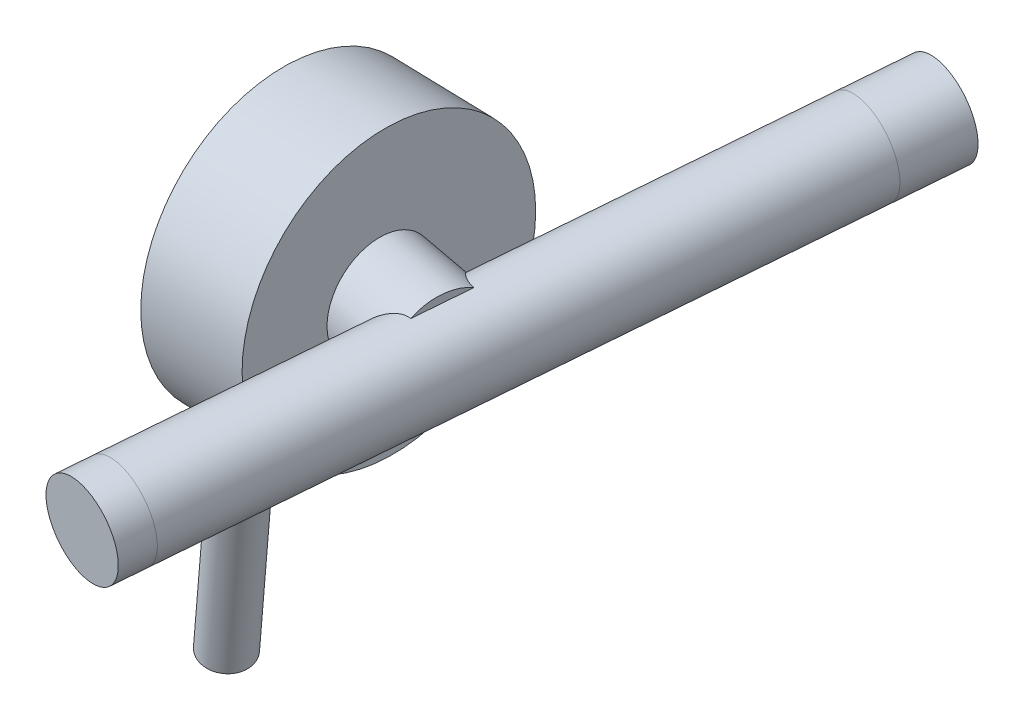
ISO-10303-21;
HEADER;
FILE_DESCRIPTION(('STEP AP214'),'2;1');
FILE_NAME('part.step','',(''),(''),'','','');
FILE_SCHEMA(('AUTOMOTIVE_DESIGN { 1 0 10303 214 1 1 1 1 }'));
ENDSEC;
DATA;
#1=APPLICATION_CONTEXT('core data for automotive mechanical design processes');
#2=APPLICATION_PROTOCOL_DEFINITION('international standard','automotive_design',2000,#1);
#3=PRODUCT_CONTEXT('',#1,'mechanical');
#4=PRODUCT('Part','Part','',(#3));
#5=PRODUCT_RELATED_PRODUCT_CATEGORY('part','',(#4));
#6=PRODUCT_DEFINITION_FORMATION('','',#4);
#7=PRODUCT_DEFINITION_CONTEXT('part definition',#1,'design');
#8=PRODUCT_DEFINITION('design','',#6,#7);
#9=PRODUCT_DEFINITION_SHAPE('','',#8);
#10=(LENGTH_UNIT() NAMED_UNIT(*) SI_UNIT(.MILLI.,.METRE.));
#11=(NAMED_UNIT(*) PLANE_ANGLE_UNIT() SI_UNIT($,.RADIAN.));
#12=(NAMED_UNIT(*) SI_UNIT($,.STERADIAN.) SOLID_ANGLE_UNIT());
#13=UNCERTAINTY_MEASURE_WITH_UNIT(LENGTH_MEASURE(1.E-05),#10,'distance_accuracy_value','');
#14=(GEOMETRIC_REPRESENTATION_CONTEXT(3) GLOBAL_UNCERTAINTY_ASSIGNED_CONTEXT((#13)) GLOBAL_UNIT_ASSIGNED_CONTEXT((#10,
#11,#12)) REPRESENTATION_CONTEXT('',''));
#15=CARTESIAN_POINT('',(0.,0.,0.));
#16=DIRECTION('',(0.,0.,1.));
#17=DIRECTION('',(1.,0.,0.));
#18=AXIS2_PLACEMENT_3D('',#15,#16,#17);
#19=CARTESIAN_POINT('',(-563.274706,-121.170213,-161.19642));
#20=DIRECTION('',(-0.984920558654944,0.0150785627794462,-0.172348861566705));
#21=DIRECTION('',(-0.172368457790249,0.,0.985032545025296));
#22=AXIS2_PLACEMENT_3D('',#19,#20,#21);
#23=CYLINDRICAL_SURFACE('',#22,20.);
#24=CARTESIAN_POINT('',(-563.274706,-121.170213,-161.19642));
#25=DIRECTION('',(-0.984920558654944,0.0150785627794465,-0.172348861566706));
#26=DIRECTION('',(-0.172368457790251,0.,0.985032545025295));
#27=AXIS2_PLACEMENT_3D('',#24,#25,#26);
#28=CIRCLE('',#27,20.);
#29=CARTESIAN_POINT('',(-565.097450261875,-105.139299613296,-149.377476758585));
#30=VERTEX_POINT('',#29);
#31=CARTESIAN_POINT('',(-561.45196203915,-103.330507277832,-170.052068152429));
#32=VERTEX_POINT('',#31);
#33=EDGE_CURVE('E115',#30,#32,#28,.T.);
#34=ORIENTED_EDGE('',*,*,#33,.T.);
#35=CARTESIAN_POINT('',(-561.451962021397,-103.330507278104,-170.052068149323));
#36=CARTESIAN_POINT('',(-561.596475889749,-103.32829304704,-170.077345476562));
#37=CARTESIAN_POINT('',(-561.74043146431,-103.327712516382,-170.105814063614));
#38=CARTESIAN_POINT('',(-562.026923717287,-103.329802107138,-170.168977097938));
#39=CARTESIAN_POINT('',(-562.169460612078,-103.332471724942,-170.203670579956));
#40=CARTESIAN_POINT('',(-562.593908669798,-103.345310810928,-170.316694099299));
#41=CARTESIAN_POINT('',(-562.873320774097,-103.360300571358,-170.404084287665));
#42=CARTESIAN_POINT('',(-563.419042890209,-103.402413798827,-170.599123768826));
#43=CARTESIAN_POINT('',(-563.685488475761,-103.429346664254,-170.706440004181));
#44=CARTESIAN_POINT('',(-564.208925639527,-103.494749977867,-170.939337341159));
#45=CARTESIAN_POINT('',(-564.465911543866,-103.533227227691,-171.064929187748));
#46=CARTESIAN_POINT('',(-565.075390868116,-103.639526156035,-171.387036293283));
#47=CARTESIAN_POINT('',(-565.422854293078,-103.712889705745,-171.591239191956));
#48=CARTESIAN_POINT('',(-566.098270328145,-103.880144033117,-172.022138488059));
#49=CARTESIAN_POINT('',(-566.426214435234,-103.97404367466,-172.248844575271));
#50=CARTESIAN_POINT('',(-567.066707702332,-104.182140801681,-172.720095146897));
#51=CARTESIAN_POINT('',(-567.379103354783,-104.296503103046,-172.964774181211));
#52=CARTESIAN_POINT('',(-567.987108949352,-104.544256457816,-173.464925160953));
#53=CARTESIAN_POINT('',(-568.28271945512,-104.677646871723,-173.720396743461));
#54=CARTESIAN_POINT('',(-569.000936212822,-105.033601249833,-174.365804861233));
#55=CARTESIAN_POINT('',(-569.414183878563,-105.267676529546,-174.759855055476));
#56=CARTESIAN_POINT('',(-570.210124718801,-105.777324677648,-175.552197346796));
#57=CARTESIAN_POINT('',(-570.592803609315,-106.052916774178,-175.950491329499));
#58=CARTESIAN_POINT('',(-571.328098627827,-106.645350933814,-176.741919672152));
#59=CARTESIAN_POINT('',(-571.680783394182,-106.962094380668,-177.135063969752));
#60=CARTESIAN_POINT('',(-572.356876792313,-107.638032733935,-177.909658478188));
#61=CARTESIAN_POINT('',(-572.680297227486,-107.997210389055,-178.291113362373));
#62=CARTESIAN_POINT('',(-573.228905901022,-108.675309651957,-178.953723116559));
#63=CARTESIAN_POINT('',(-573.46009304718,-108.985814411616,-179.23854507896));
#64=CARTESIAN_POINT('',(-573.902489266454,-109.633353031232,-179.793269040998));
#65=CARTESIAN_POINT('',(-574.113699014057,-109.970385994826,-180.063171544226));
#66=CARTESIAN_POINT('',(-574.514233240568,-110.670410839141,-180.58405597669));
#67=CARTESIAN_POINT('',(-574.703581318173,-111.033374030825,-180.835058204139));
#68=CARTESIAN_POINT('',(-575.058604595544,-111.784879267886,-181.314545136572));
#69=CARTESIAN_POINT('',(-575.224284286143,-112.173416440371,-181.543034110655));
#70=CARTESIAN_POINT('',(-575.502415196587,-112.903082342256,-181.93501351575));
#71=CARTESIAN_POINT('',(-575.619088313071,-113.240286763876,-182.102824733942));
#72=CARTESIAN_POINT('',(-575.833605360589,-113.929755802308,-182.418283906259));
#73=CARTESIAN_POINT('',(-575.9314529783,-114.282017453851,-182.56593580662));
#74=CARTESIAN_POINT('',(-576.107019394345,-114.999830573526,-182.83889154527));
#75=CARTESIAN_POINT('',(-576.184746043951,-115.365376794285,-182.96420409449));
#76=CARTESIAN_POINT('',(-576.318967498026,-116.10773718032,-183.190602103708));
#77=CARTESIAN_POINT('',(-576.375462062505,-116.484551472909,-183.291687289855));
#78=CARTESIAN_POINT('',(-576.466504851294,-117.248607847359,-183.468421505566));
#79=CARTESIAN_POINT('',(-576.500949279164,-117.635890432124,-183.543949455748));
#80=CARTESIAN_POINT('',(-576.546863282836,-118.416147331103,-183.667744321387));
#81=CARTESIAN_POINT('',(-576.558332809409,-118.80912165751,-183.716011178431));
#82=CARTESIAN_POINT('',(-576.558088125149,-119.597463176672,-183.78468600133));
#83=CARTESIAN_POINT('',(-576.546375352005,-119.992830219523,-183.805095694662));
#84=CARTESIAN_POINT('',(-576.499981477015,-120.782651405814,-183.818085172546));
#85=CARTESIAN_POINT('',(-576.465301316834,-121.177105586017,-183.810666098022));
#86=CARTESIAN_POINT('',(-576.376994667211,-121.932785869265,-183.770197446301));
#87=CARTESIAN_POINT('',(-576.324964174316,-122.294306568367,-183.739089658597));
#88=CARTESIAN_POINT('',(-576.202489149993,-123.011521927875,-183.654481258899));
#89=CARTESIAN_POINT('',(-576.132045737895,-123.367216941031,-183.600982007973));
#90=CARTESIAN_POINT('',(-575.97365399276,-124.070796525606,-183.472804589789));
#91=CARTESIAN_POINT('',(-575.885704791599,-124.418680708727,-183.398125372123));
#92=CARTESIAN_POINT('',(-575.693321162239,-125.104952025338,-183.229029756566));
#93=CARTESIAN_POINT('',(-575.588885706566,-125.443338565356,-183.134612128398));
#94=CARTESIAN_POINT('',(-575.355709967141,-126.135606455282,-182.919427364497));
#95=CARTESIAN_POINT('',(-575.2257003355,-126.488594909705,-182.79716634167));
#96=CARTESIAN_POINT('',(-574.949025176494,-127.180609253974,-182.533582075851));
#97=CARTESIAN_POINT('',(-574.80235921858,-127.519634782583,-182.392258340091));
#98=CARTESIAN_POINT('',(-574.493500867029,-128.182969031828,-182.092561077296));
#99=CARTESIAN_POINT('',(-574.331300362961,-128.507269933208,-181.934178638649));
#100=CARTESIAN_POINT('',(-573.992493023641,-129.140363078291,-181.602471918021));
#101=CARTESIAN_POINT('',(-573.815883300284,-129.449152192757,-181.429144640181));
#102=CARTESIAN_POINT('',(-573.358226465946,-130.19997136593,-180.980376925178));
#103=CARTESIAN_POINT('',(-573.068812047359,-130.632159008756,-180.696914663435));
#104=CARTESIAN_POINT('',(-572.4619440652,-131.460107382771,-180.107478102608));
#105=CARTESIAN_POINT('',(-572.144477600255,-131.855851180464,-179.801493456208));
#106=CARTESIAN_POINT('',(-571.482006287349,-132.61109743033,-179.172855885211));
#107=CARTESIAN_POINT('',(-571.136947474235,-132.970525588939,-178.850170754959));
#108=CARTESIAN_POINT('',(-570.419792959208,-133.6516572846,-178.19547436709));
#109=CARTESIAN_POINT('',(-570.047706029576,-133.973372973837,-177.863466156654));
#110=CARTESIAN_POINT('',(-569.36333437614,-134.508947434728,-177.273937540379));
#111=CARTESIAN_POINT('',(-569.056855250208,-134.730638739525,-177.016761639515));
#112=CARTESIAN_POINT('',(-568.425371944789,-135.150277921796,-176.505559660524));
#113=CARTESIAN_POINT('',(-568.100365375027,-135.348222725397,-176.251533993988));
#114=CARTESIAN_POINT('',(-567.430736153044,-135.718524956787,-175.75253912241));
#115=CARTESIAN_POINT('',(-567.086158473374,-135.890938005386,-175.507551130598));
#116=CARTESIAN_POINT('',(-566.374591763382,-136.208480003882,-175.032957808967));
#117=CARTESIAN_POINT('',(-566.007616671438,-136.35362569801,-174.803343094915));
#118=CARTESIAN_POINT('',(-565.385161086524,-136.566959721507,-174.44629442918));
#119=CARTESIAN_POINT('',(-565.136829223628,-136.644090858013,-174.31172073736));
#120=CARTESIAN_POINT('',(-564.629949747482,-136.784768117298,-174.055398600741));
#121=CARTESIAN_POINT('',(-564.371406170727,-136.848319545445,-173.933645156748));
#122=CARTESIAN_POINT('',(-563.845167718497,-136.96052897789,-173.706303227874));
#123=CARTESIAN_POINT('',(-563.577505658132,-137.00923517204,-173.600663007245));
#124=CARTESIAN_POINT('',(-563.033309481247,-137.090891704814,-173.408054159579));
#125=CARTESIAN_POINT('',(-562.756781509485,-137.123852714499,-173.321072908795));
#126=CARTESIAN_POINT('',(-562.308254139118,-137.163348069329,-173.198609888616));
#127=CARTESIAN_POINT('',(-562.138517620636,-137.1751791635,-173.156419048474));
#128=CARTESIAN_POINT('',(-561.796776235541,-137.192754149861,-173.079897598237));
#129=CARTESIAN_POINT('',(-561.624769086358,-137.198491355133,-173.045575655109));
#130=CARTESIAN_POINT('',(-561.451961916283,-137.201127110868,-173.015362286653));
#131=B_SPLINE_CURVE_WITH_KNOTS('',3,(#35,#36,#37,#38,#39,#40,#41,#42,#43,#44,#45,#46,#47,#48,
#49,#50,#51,#52,#53,#54,#55,#56,#57,#58,#59,#60,#61,#62,#63,#64,#65,#66,#67,#68,#69,#70,#71,#72,
#73,#74,#75,#76,#77,#78,#79,#80,#81,#82,#83,#84,#85,#86,#87,#88,#89,#90,#91,#92,#93,#94,#95,#96,
#97,#98,#99,#100,#101,#102,#103,#104,#105,#106,#107,#108,#109,#110,#111,#112,#113,#114,#115,
#116,#117,#118,#119,#120,#121,#122,#123,#124,#125,#126,#127,#128,#129,#130),.UNSPECIFIED.,.F.,
.F.,(4,2,2,2,2,2,2,2,2,2,2,2,2,2,2,2,2,2,2,2,2,2,2,2,2,2,2,2,2,2,2,2,2,2,2,2,2,2,2,2,2,2,2,2,2,
2,2,4),(0.,0.440081998073616,0.880095814332577,1.75811045649046,2.62259059881847,
3.48758107288393,4.71450351102598,5.94195656793929,7.17978185087975,8.41756554268194,
10.2664758687344,12.1162451486926,13.9616606505107,15.8063284782708,17.2469131718879,
18.6874492103265,20.1264154212997,21.5651082395403,22.7468833900109,23.928426872418,
25.1095086151235,26.2906037074106,27.4772184525093,28.6638357401912,29.8503794401515,
31.0368744947619,32.1353689254055,33.2337965935985,34.3322787471969,35.4308293885837,
36.6163133418857,37.8018279457251,38.9879649044096,40.1743401927535,41.9489029574983,
43.7242861492035,45.5032308036363,47.2816006392303,48.6529217308616,50.0244201424228,
51.3928853507359,52.7605074506132,53.6382433920214,54.5156357869548,55.3901489327523,
56.2640685465976,56.7896991227311,57.3159058873451),.UNSPECIFIED.);
#132=CARTESIAN_POINT('',(-561.451961934036,-137.201127110596,-173.01536228976));
#133=VERTEX_POINT('',#132);
#134=EDGE_CURVE('E88',#32,#133,#131,.T.);
#135=ORIENTED_EDGE('',*,*,#134,.T.);
#136=CARTESIAN_POINT('',(-565.097449800445,-139.009919269266,-152.340772916684));
#137=VERTEX_POINT('',#136);
#138=EDGE_CURVE('E117',#133,#137,#28,.T.);
#139=ORIENTED_EDGE('',*,*,#138,.T.);
#140=CARTESIAN_POINT('',(-565.097449800445,-139.009919269266,-152.340772916684));
#141=CARTESIAN_POINT('',(-565.241960044269,-139.007708708725,-152.366071218374));
#142=CARTESIAN_POINT('',(-565.386980322959,-139.003865186857,-152.388169815578));
#143=CARTESIAN_POINT('',(-565.677704050233,-138.992938755122,-152.426012406893));
#144=CARTESIAN_POINT('',(-565.823407389493,-138.985856347225,-152.441757384992));
#145=CARTESIAN_POINT('',(-566.260436807756,-138.959828543664,-152.479481721859));
#146=CARTESIAN_POINT('',(-566.552346175264,-138.936092185875,-152.492065693759));
#147=CARTESIAN_POINT('',(-567.13036471168,-138.876775148864,-152.493666867576));
#148=CARTESIAN_POINT('',(-567.416493926842,-138.841382688788,-152.483044358524));
#149=CARTESIAN_POINT('',(-567.985722521374,-138.759251308286,-152.441349957311));
#150=CARTESIAN_POINT('',(-568.268820012417,-138.712505701995,-152.410265996892));
#151=CARTESIAN_POINT('',(-568.948012038329,-138.586477980298,-152.313660369262));
#152=CARTESIAN_POINT('',(-569.3418230347,-138.501765960046,-152.23917128422));
#153=CARTESIAN_POINT('',(-570.118129021366,-138.312286634984,-152.062305304618));
#154=CARTESIAN_POINT('',(-570.500619044063,-138.207510672518,-151.959916363084));
#155=CARTESIAN_POINT('',(-571.256578970473,-137.978034686711,-151.733027749485));
#156=CARTESIAN_POINT('',(-571.629945340298,-137.853173782639,-151.60834854844));
#157=CARTESIAN_POINT('',(-572.363996206421,-137.584874356533,-151.343040774173));
#158=CARTESIAN_POINT('',(-572.724681128412,-137.441436458851,-151.202412736994));
#159=CARTESIAN_POINT('',(-573.608446580804,-137.060956693456,-150.837331575336));
#160=CARTESIAN_POINT('',(-574.123783429864,-136.812665334111,-150.60577210572));
#161=CARTESIAN_POINT('',(-575.12593926797,-136.275489388639,-150.128074334063));
#162=CARTESIAN_POINT('',(-575.612744897159,-135.986585997576,-149.881929309065));
#163=CARTESIAN_POINT('',(-576.555116126385,-135.368467757306,-149.384071653833));
#164=CARTESIAN_POINT('',(-577.010752558857,-135.039349389147,-149.132373491606));
#165=CARTESIAN_POINT('',(-577.889270796123,-134.339610846165,-148.629816640405));
#166=CARTESIAN_POINT('',(-578.312165796735,-133.969007539915,-148.378957652631));
#167=CARTESIAN_POINT('',(-579.032747925928,-133.271477710254,-147.938440462759));
#168=CARTESIAN_POINT('',(-579.33756982759,-132.952766966514,-147.747413399321));
#169=CARTESIAN_POINT('',(-579.922578202449,-132.289499383972,-147.372472426384));
#170=CARTESIAN_POINT('',(-580.202765507349,-131.944943418475,-147.188558276859));
#171=CARTESIAN_POINT('',(-580.735370392057,-131.230632757669,-146.830961544606));
#172=CARTESIAN_POINT('',(-580.987817901248,-130.860905931916,-146.657268030414));
#173=CARTESIAN_POINT('',(-581.462052722023,-130.096705232473,-146.322890911259));
#174=CARTESIAN_POINT('',(-581.683845849702,-129.702236073881,-146.16220484078));
#175=CARTESIAN_POINT('',(-582.056731189092,-128.962603491033,-145.884145147472));
#176=CARTESIAN_POINT('',(-582.213376030575,-128.621214732904,-145.764161157847));
#177=CARTESIAN_POINT('',(-582.5016709505,-127.924047939479,-145.536687795796));
#178=CARTESIAN_POINT('',(-582.633325922746,-127.568272738089,-145.429195978611));
#179=CARTESIAN_POINT('',(-582.869730115824,-126.84415258933,-145.228329940557));
#180=CARTESIAN_POINT('',(-582.974489831148,-126.475812608471,-145.134950219038));
#181=CARTESIAN_POINT('',(-583.155488639696,-125.728626382128,-144.963711801525));
#182=CARTESIAN_POINT('',(-583.231727410543,-125.34978001794,-144.885853280974));
#183=CARTESIAN_POINT('',(-583.354627083103,-124.582448304048,-144.746556299955));
#184=CARTESIAN_POINT('',(-583.40114809244,-124.193926182156,-144.685196276377));
#185=CARTESIAN_POINT('',(-583.463166425677,-123.41201689361,-144.580288191225));
#186=CARTESIAN_POINT('',(-583.478663683103,-123.018629716532,-144.536740167818));
#187=CARTESIAN_POINT('',(-583.47833314323,-122.230296992589,-144.467964651504));
#188=CARTESIAN_POINT('',(-583.46250728849,-121.835351543878,-144.44273602262));
#189=CARTESIAN_POINT('',(-583.399841066333,-121.047199990597,-144.410662347995));
#190=CARTESIAN_POINT('',(-583.353001970461,-120.653993815382,-144.403816548615));
#191=CARTESIAN_POINT('',(-583.233797032605,-119.901490405467,-144.407973218935));
#192=CARTESIAN_POINT('',(-583.163582133734,-119.541841211237,-144.417689566583));
#193=CARTESIAN_POINT('',(-582.998411302326,-118.829029539742,-144.451963484986));
#194=CARTESIAN_POINT('',(-582.903456873718,-118.475866669567,-144.476520153709));
#195=CARTESIAN_POINT('',(-582.690132740908,-117.777977834723,-144.539651881856));
#196=CARTESIAN_POINT('',(-582.57176187547,-117.433252289421,-144.578227636574));
#197=CARTESIAN_POINT('',(-582.313103086394,-116.753886164612,-144.668396403837));
#198=CARTESIAN_POINT('',(-582.172813796738,-116.419246215219,-144.719990227828));
#199=CARTESIAN_POINT('',(-581.85997946413,-115.735337421877,-144.839629982052));
#200=CARTESIAN_POINT('',(-581.685760407228,-115.387006534314,-144.908654747343));
#201=CARTESIAN_POINT('',(-581.315606569089,-114.704894770215,-145.059051941222));
#202=CARTESIAN_POINT('',(-581.11967122651,-114.371114270101,-145.14042468901));
#203=CARTESIAN_POINT('',(-580.707852286286,-113.718813174122,-145.314012345644));
#204=CARTESIAN_POINT('',(-580.491958270483,-113.400300681174,-145.406232923829));
#205=CARTESIAN_POINT('',(-580.042014203366,-112.779282863327,-145.599917913878));
#206=CARTESIAN_POINT('',(-579.807960512687,-112.476780767595,-145.701384179375));
#207=CARTESIAN_POINT('',(-579.203042709621,-111.742229003479,-145.964214487826));
#208=CARTESIAN_POINT('',(-578.821881116773,-111.320307497105,-146.13033424888));
#209=CARTESIAN_POINT('',(-578.026636425241,-110.513824666105,-146.474418451107));
#210=CARTESIAN_POINT('',(-577.612538187553,-110.129280704254,-146.652388332877));
#211=CARTESIAN_POINT('',(-576.753869434849,-109.39732223374,-147.014845229318));
#212=CARTESIAN_POINT('',(-576.309239458074,-109.049983755143,-147.199344601343));
#213=CARTESIAN_POINT('',(-575.392515416689,-108.393865796185,-147.568132478913));
#214=CARTESIAN_POINT('',(-574.920430272794,-108.085073892773,-147.752421033329));
#215=CARTESIAN_POINT('',(-574.060974429415,-107.573134519696,-148.071798978));
#216=CARTESIAN_POINT('',(-573.678946100703,-107.361983849907,-148.208494619027));
#217=CARTESIAN_POINT('',(-572.89924795385,-106.963949010156,-148.472757357464));
#218=CARTESIAN_POINT('',(-572.50157611956,-106.777067981527,-148.600323272214));
#219=CARTESIAN_POINT('',(-571.691625318155,-106.429417240478,-148.840410002021));
#220=CARTESIAN_POINT('',(-571.279380601228,-106.268590694384,-148.952963466847));
#221=CARTESIAN_POINT('',(-570.439854240905,-105.974795015306,-149.156134750362));
#222=CARTESIAN_POINT('',(-570.012582018206,-105.841808780477,-149.246766040832));
#223=CARTESIAN_POINT('',(-569.299833941483,-105.648915939976,-149.370170638625));
#224=CARTESIAN_POINT('',(-569.018389215446,-105.579895371051,-149.41204000465));
#225=CARTESIAN_POINT('',(-568.45065323526,-105.455669843966,-149.480317776924));
#226=CARTESIAN_POINT('',(-568.164363921161,-105.400459488941,-149.506732228189));
#227=CARTESIAN_POINT('',(-567.589112190269,-105.305113229816,-149.541327047207));
#228=CARTESIAN_POINT('',(-567.300161628541,-105.264928451987,-149.549566967432));
#229=CARTESIAN_POINT('',(-566.720726547363,-105.200474064248,-149.545554290283));
#230=CARTESIAN_POINT('',(-566.43024320211,-105.176193671226,-149.533315597381));
#231=CARTESIAN_POINT('',(-565.965816752218,-105.150675118757,-149.496023024127));
#232=CARTESIAN_POINT('',(-565.791566009846,-105.144110274235,-149.478020360059));
#233=CARTESIAN_POINT('',(-565.443781318421,-105.137091537884,-149.433883303701));
#234=CARTESIAN_POINT('',(-565.270248364488,-105.136644352673,-149.407740019173));
#235=CARTESIAN_POINT('',(-565.097450261875,-105.139299613296,-149.377476758585));
#236=B_SPLINE_CURVE_WITH_KNOTS('',3,(#140,#141,#142,#143,#144,#145,#146,#147,#148,#149,#150,
#151,#152,#153,#154,#155,#156,#157,#158,#159,#160,#161,#162,#163,#164,#165,#166,#167,#168,#169,
#170,#171,#172,#173,#174,#175,#176,#177,#178,#179,#180,#181,#182,#183,#184,#185,#186,#187,#188,
#189,#190,#191,#192,#193,#194,#195,#196,#197,#198,#199,#200,#201,#202,#203,#204,#205,#206,#207,
#208,#209,#210,#211,#212,#213,#214,#215,#216,#217,#218,#219,#220,#221,#222,#223,#224,#225,#226,
#227,#228,#229,#230,#231,#232,#233,#234,#235),.UNSPECIFIED.,.F.,.F.,(4,2,2,2,2,2,2,2,2,2,2,2,2,
2,2,2,2,2,2,2,2,2,2,2,2,2,2,2,2,2,2,2,2,2,2,2,2,2,2,2,2,2,2,2,2,2,2,4),(0.,0.440081967189268,
0.880095752557208,1.75811033283668,2.62259041296391,3.48758082485081,4.71450320842809,
5.94195621081884,7.17978144003128,8.41756507807764,10.2664754761279,12.1162448282994,
13.961660401785,15.8063283011111,17.2469130455479,18.6874491348286,20.1264153965325,
21.5651082654607,22.7468834360475,23.9284269385497,25.1095087013396,26.2906038137111,
27.4772185802164,28.6638358893051,29.8503796105312,31.0368746863851,32.1353691162647,
33.2337967836791,34.3322789364945,35.4308295770969,36.6163135086503,37.801828090725,
38.9879650275563,40.1743402940387,41.9489029937798,43.7242861203881,45.503230709793,
47.2816004804818,48.6529216189348,50.0244200773236,51.3928853321692,52.7605074785655,
53.638243479714,54.515635934371,55.3901491399768,56.2640688135679,56.7896992772254,
57.3159059286203),.UNSPECIFIED.);
#237=EDGE_CURVE('E107',#137,#30,#236,.T.);
#238=ORIENTED_EDGE('',*,*,#237,.T.);
#239=EDGE_LOOP('',(#34,#135,#139,#238));
#240=FACE_BOUND('',#239,.T.);
#241=CARTESIAN_POINT('',(-593.668851124536,-120.704896258096,-166.515017793979));
#242=DIRECTION('',(-0.999657324931295,0.,-0.0261769499982009));
#243=DIRECTION('',(0.0260394017219689,0.102379214978631,-0.994404568522451));
#244=AXIS2_PLACEMENT_3D('',#241,#242,#243);
#245=ELLIPSE('',#244,20.2205124025565,20.);
#246=CARTESIAN_POINT('',(-593.142321079061,-118.634736071856,-186.622387704946));
#247=VERTEX_POINT('',#246);
#248=EDGE_CURVE('E83',#247,#247,#245,.F.);
#249=ORIENTED_EDGE('',*,*,#248,.T.);
#250=EDGE_LOOP('',(#249));
#251=FACE_BOUND('',#250,.T.);
#252=ADVANCED_FACE('F79',(#240,#251),#23,.T.);
#253=CARTESIAN_POINT('',(-534.716988,-107.000649,-323.155287));
#254=DIRECTION('',(0.173007190424965,0.0858414606043045,-0.981172643168662));
#255=DIRECTION('',(-0.984807756324709,0.,-0.173648158880805));
#256=AXIS2_PLACEMENT_3D('',#253,#254,#255);
#257=PLANE('',#256);
#258=CARTESIAN_POINT('',(-534.716988,-107.000649,-323.155287));
#259=DIRECTION('',(0.173007190424965,0.0858414606043045,-0.981172643168662));
#260=DIRECTION('',(-0.984807756324709,0.,-0.173648158880805));
#261=AXIS2_PLACEMENT_3D('',#258,#259,#260);
#262=CIRCLE('',#261,17.);
#263=CARTESIAN_POINT('',(-551.45871985752,-107.000649,-326.107305700974));
#264=VERTEX_POINT('',#263);
#265=EDGE_CURVE('E118',#264,#264,#262,.T.);
#266=ORIENTED_EDGE('',*,*,#265,.T.);
#267=EDGE_LOOP('',(#266));
#268=FACE_BOUND('',#267,.T.);
#269=ADVANCED_FACE('F81',(#268),#257,.T.);
#270=CARTESIAN_POINT('',(-539.215175,-109.232527,-297.644798));
#271=DIRECTION('',(0.173007190424964,0.085841460604302,-0.981172643168663));
#272=DIRECTION('',(-0.984807756324709,0.,-0.173648158880804));
#273=AXIS2_PLACEMENT_3D('',#270,#271,#272);
#274=CYLINDRICAL_SURFACE('',#273,17.);
#275=ORIENTED_EDGE('',*,*,#265,.F.);
#276=EDGE_LOOP('',(#275));
#277=FACE_BOUND('',#276,.T.);
#278=CARTESIAN_POINT('',(-539.215175787186,-109.232527302237,-297.644798165244));
#279=DIRECTION('',(0.173007190424965,0.0858414606043045,-0.981172643168662));
#280=DIRECTION('',(-0.984807756324709,0.,-0.173648158880805));
#281=AXIS2_PLACEMENT_3D('',#278,#279,#280);
#282=CIRCLE('',#281,17.);
#283=CARTESIAN_POINT('',(-555.956907644706,-109.232527302237,-300.596816866218));
#284=VERTEX_POINT('',#283);
#285=EDGE_CURVE('E132',#284,#284,#282,.T.);
#286=ORIENTED_EDGE('',*,*,#285,.T.);
#287=EDGE_LOOP('',(#286));
#288=FACE_BOUND('',#287,.T.);
#289=ADVANCED_FACE('F153',(#277,#288),#274,.T.);
#290=CARTESIAN_POINT('',(-582.,-130.461196,-55.));
#291=DIRECTION('',(0.173007207138552,0.0858414811850425,-0.981172638421025));
#292=DIRECTION('',(-0.984807753312239,0.,-0.173648175965372));
#293=AXIS2_PLACEMENT_3D('',#290,#291,#292);
#294=CYLINDRICAL_SURFACE('',#293,17.);
#295=CARTESIAN_POINT('',(-569.001568742246,-142.87048978206,-95.9679980834158));
#296=CARTESIAN_POINT('',(-569.002636656639,-142.875985882191,-95.7457297812961));
#297=CARTESIAN_POINT('',(-569.012650914718,-142.884614048399,-95.5236256311897));
#298=CARTESIAN_POINT('',(-569.050720124422,-142.908470016066,-95.0812602308505));
#299=CARTESIAN_POINT('',(-569.078777604897,-142.923698742529,-94.8609992433306));
#300=CARTESIAN_POINT('',(-569.152840991225,-142.960812421363,-94.4239779276873));
#301=CARTESIAN_POINT('',(-569.198855826793,-142.98270068415,-94.207219397177));
#302=CARTESIAN_POINT('',(-569.308411737744,-143.03284751231,-93.7789429848329));
#303=CARTESIAN_POINT('',(-569.371952319807,-143.061105898372,-93.5674249556711));
#304=CARTESIAN_POINT('',(-569.515677653803,-143.1233255178,-93.1516730917354));
#305=CARTESIAN_POINT('',(-569.595815535969,-143.157270641656,-92.94742060283));
#306=CARTESIAN_POINT('',(-569.771971437023,-143.230098859658,-92.5468099496523));
#307=CARTESIAN_POINT('',(-569.867989706749,-143.268982031801,-92.3504519101381));
#308=CARTESIAN_POINT('',(-570.074932804509,-143.350697255631,-91.9665942798771));
#309=CARTESIAN_POINT('',(-570.185859848429,-143.393529894029,-91.7790960115653));
#310=CARTESIAN_POINT('',(-570.421622814296,-143.482053686582,-91.4136812716609));
#311=CARTESIAN_POINT('',(-570.546464266672,-143.527745974148,-91.2357686519607));
#312=CARTESIAN_POINT('',(-570.815432623613,-143.623099877084,-90.88171632308));
#313=CARTESIAN_POINT('',(-570.96020446571,-143.672846304248,-90.7060898239901));
#314=CARTESIAN_POINT('',(-571.262816056816,-143.772869954491,-90.3665579973611));
#315=CARTESIAN_POINT('',(-571.420660098542,-143.823147347163,-90.2026565533523));
#316=CARTESIAN_POINT('',(-571.748368247297,-143.922905331489,-89.8870024394266));
#317=CARTESIAN_POINT('',(-571.918235439922,-143.97238571457,-89.7352529096042));
#318=CARTESIAN_POINT('',(-572.268972782652,-144.069248257176,-89.4443090686312));
#319=CARTESIAN_POINT('',(-572.449843787754,-144.116630253161,-89.3051157351883));
#320=CARTESIAN_POINT('',(-572.847857880751,-144.214489644033,-89.0209397871829));
#321=CARTESIAN_POINT('',(-573.066520646354,-144.264462332701,-88.8779054355191));
#322=CARTESIAN_POINT('',(-573.515487379016,-144.358245666845,-88.6092959471211));
#323=CARTESIAN_POINT('',(-573.745788037316,-144.402058050501,-88.4837158856303));
#324=CARTESIAN_POINT('',(-574.216841014191,-144.48186407287,-88.2505376659293));
#325=CARTESIAN_POINT('',(-574.457600460249,-144.517852275976,-88.1429520206794));
#326=CARTESIAN_POINT('',(-574.947769187574,-144.580342739974,-87.9466483249095));
#327=CARTESIAN_POINT('',(-575.197174389947,-144.606849409015,-87.8579215143606));
#328=CARTESIAN_POINT('',(-575.705349360606,-144.649104932443,-87.6993249757849));
#329=CARTESIAN_POINT('',(-575.964183974576,-144.664753038179,-87.6296353923623));
#330=CARTESIAN_POINT('',(-576.48704008146,-144.683543531888,-87.5109898366326));
#331=CARTESIAN_POINT('',(-576.751061695795,-144.686685626755,-87.4620343502986));
#332=CARTESIAN_POINT('',(-577.281798017018,-144.679358792521,-87.3856041795365));
#333=CARTESIAN_POINT('',(-577.548510198708,-144.668901626503,-87.3581109635851));
#334=CARTESIAN_POINT('',(-578.082338685092,-144.633611151574,-87.3250814062685));
#335=CARTESIAN_POINT('',(-578.349454930282,-144.60877978627,-87.3195420971994));
#336=CARTESIAN_POINT('',(-578.852700744337,-144.54784249968,-87.3300900948519));
#337=CARTESIAN_POINT('',(-579.089063173623,-144.513242652263,-87.3439078250324));
#338=CARTESIAN_POINT('',(-579.558054820119,-144.432333294107,-87.3892146015842));
#339=CARTESIAN_POINT('',(-579.790684327489,-144.38602469822,-87.4207022675656));
#340=CARTESIAN_POINT('',(-580.250256664485,-144.282030310696,-87.5011048984391));
#341=CARTESIAN_POINT('',(-580.477200820976,-144.22434720209,-87.5500157557237));
#342=CARTESIAN_POINT('',(-580.923671678718,-144.098201457026,-87.6648170731303));
#343=CARTESIAN_POINT('',(-581.143198495384,-144.029738988391,-87.7307072689128));
#344=CARTESIAN_POINT('',(-581.560149222484,-143.887361588493,-87.8743232639545));
#345=CARTESIAN_POINT('',(-581.75810570066,-143.814030578558,-87.9510868507469));
#346=CARTESIAN_POINT('',(-582.14497648776,-143.659473419702,-88.1184142126972));
#347=CARTESIAN_POINT('',(-582.333887691021,-143.578244587695,-88.2089826836889));
#348=CARTESIAN_POINT('',(-582.701581589679,-143.408942742608,-88.4031590516454));
#349=CARTESIAN_POINT('',(-582.880367070051,-143.320871627388,-88.5067633377397));
#350=CARTESIAN_POINT('',(-583.227164831407,-143.138925568134,-88.7263273307782));
#351=CARTESIAN_POINT('',(-583.395172886054,-143.045048375265,-88.8422918378745));
#352=CARTESIAN_POINT('',(-583.72910873756,-142.847124059696,-89.0928282349714));
#353=CARTESIAN_POINT('',(-583.89435813287,-142.742802646437,-89.2280874534132));
#354=CARTESIAN_POINT('',(-584.211577695944,-142.530368780394,-89.5107676111577));
#355=CARTESIAN_POINT('',(-584.363543291659,-142.422255040159,-89.6581927040626));
#356=CARTESIAN_POINT('',(-584.653796236227,-142.203676277419,-89.9644380325519));
#357=CARTESIAN_POINT('',(-584.792079057971,-142.093210491303,-90.1232620098053));
#358=CARTESIAN_POINT('',(-585.05462195989,-141.871431704194,-90.4515556848104));
#359=CARTESIAN_POINT('',(-585.178881152771,-141.760118650067,-90.62102605512));
#360=CARTESIAN_POINT('',(-585.426048276911,-141.525914219378,-90.9892034509871));
#361=CARTESIAN_POINT('',(-585.547298456519,-141.40309862704,-91.1890743478615));
#362=CARTESIAN_POINT('',(-585.771911466149,-141.160403794949,-91.6003212469484));
#363=CARTESIAN_POINT('',(-585.875273904204,-141.04052461959,-91.8116975011402));
#364=CARTESIAN_POINT('',(-586.063846226106,-140.805845348593,-92.2452803876003));
#365=CARTESIAN_POINT('',(-586.149046502566,-140.691047966426,-92.4674926759073));
#366=CARTESIAN_POINT('',(-586.300871943713,-140.468891707857,-92.9218237650583));
#367=CARTESIAN_POINT('',(-586.367494585584,-140.361533843216,-93.1539439064433));
#368=CARTESIAN_POINT('',(-586.483066993727,-140.154280514835,-93.6325616015165));
#369=CARTESIAN_POINT('',(-586.531570759242,-140.054616041645,-93.8792677975847));
#370=CARTESIAN_POINT('',(-586.608203571283,-139.868226445178,-94.3804844047686));
#371=CARTESIAN_POINT('',(-586.63634390842,-139.781494172787,-94.6349904095139));
#372=CARTESIAN_POINT('',(-586.671861344534,-139.623471262013,-95.1498525815739));
#373=CARTESIAN_POINT('',(-586.679264638037,-139.552161247835,-95.4102009493061));
#374=CARTESIAN_POINT('',(-586.673118496611,-139.42700235287,-95.93481184322));
#375=CARTESIAN_POINT('',(-586.659573267546,-139.373149969715,-96.1990735731608));
#376=CARTESIAN_POINT('',(-586.614721263754,-139.290326976938,-96.6938248988831));
#377=CARTESIAN_POINT('',(-586.585999405429,-139.259008110358,-96.9241605209425));
#378=CARTESIAN_POINT('',(-586.512991192696,-139.211229756755,-97.3838950733002));
#379=CARTESIAN_POINT('',(-586.468706311439,-139.194768863847,-97.6132940901764));
#380=CARTESIAN_POINT('',(-586.364959411359,-139.176750610438,-98.0692191528776));
#381=CARTESIAN_POINT('',(-586.30549725608,-139.175193383937,-98.2957451728529));
#382=CARTESIAN_POINT('',(-586.171944546727,-139.186523981364,-98.7440616286124));
#383=CARTESIAN_POINT('',(-586.097854006256,-139.199411791861,-98.9658520687998));
#384=CARTESIAN_POINT('',(-585.941709051852,-139.237285421599,-99.386805264664));
#385=CARTESIAN_POINT('',(-585.860651501386,-139.261304070543,-99.5864269640254));
#386=CARTESIAN_POINT('',(-585.687096504684,-139.320004771875,-99.9790503071235));
#387=CARTESIAN_POINT('',(-585.594595282274,-139.354690349766,-100.172049738671));
#388=CARTESIAN_POINT('',(-585.300786441609,-139.473102048205,-100.739483625971));
#389=CARTESIAN_POINT('',(-585.08307909942,-139.571208346006,-101.102607599949));
#390=CARTESIAN_POINT('',(-584.581777894233,-139.808502126842,-101.830042980643));
#391=CARTESIAN_POINT('',(-584.29356687573,-139.951025684021,-102.19007409544));
#392=CARTESIAN_POINT('',(-583.828012748722,-140.181434271423,-102.691131603801));
#393=CARTESIAN_POINT('',(-583.66717031151,-140.261066216228,-102.851746458855));
#394=CARTESIAN_POINT('',(-583.33473852738,-140.424414950012,-103.159326193284));
#395=CARTESIAN_POINT('',(-583.163147507843,-140.508132374295,-103.306288939334));
#396=CARTESIAN_POINT('',(-582.788068212301,-140.688572318674,-103.602861372005));
#397=CARTESIAN_POINT('',(-582.583248638056,-140.785630807292,-103.750586080485));
#398=CARTESIAN_POINT('',(-582.161538809624,-140.980945208694,-104.026579610412));
#399=CARTESIAN_POINT('',(-581.944652792607,-141.079200691802,-104.154855203266));
#400=CARTESIAN_POINT('',(-581.499585178943,-141.275009972673,-104.390827308737));
#401=CARTESIAN_POINT('',(-581.271401791841,-141.372563656387,-104.498520546144));
#402=CARTESIAN_POINT('',(-580.804882837578,-141.565055759576,-104.692058951498));
#403=CARTESIAN_POINT('',(-580.56654795446,-141.659994354558,-104.777905588832));
#404=CARTESIAN_POINT('',(-580.087709005646,-141.84291692873,-104.924529076809));
#405=CARTESIAN_POINT('',(-579.847440150879,-141.93101981984,-104.985924150405));
#406=CARTESIAN_POINT('',(-579.360174901956,-142.101451170629,-105.085899366458));
#407=CARTESIAN_POINT('',(-579.113178536746,-142.18377965515,-105.124479607062));
#408=CARTESIAN_POINT('',(-578.614561119791,-142.341154946208,-105.177996700564));
#409=CARTESIAN_POINT('',(-578.36294404815,-142.416207699302,-105.192953017183));
#410=CARTESIAN_POINT('',(-577.857074293422,-142.557868891034,-105.198769776787));
#411=CARTESIAN_POINT('',(-577.602821929321,-142.624478339064,-105.189633102927));
#412=CARTESIAN_POINT('',(-577.122412011027,-142.741399837577,-105.149509110838));
#413=CARTESIAN_POINT('',(-576.896278643343,-142.792700730385,-105.121068241018));
#414=CARTESIAN_POINT('',(-576.445555264292,-142.887427780152,-105.045247031403));
#415=CARTESIAN_POINT('',(-576.22096512358,-142.930854605014,-104.997868299067));
#416=CARTESIAN_POINT('',(-575.775083950898,-143.009597937544,-104.884611742913));
#417=CARTESIAN_POINT('',(-575.553792596009,-143.044915243997,-104.818735742491));
#418=CARTESIAN_POINT('',(-575.116153129454,-143.10744268972,-104.669147259147));
#419=CARTESIAN_POINT('',(-574.8998050623,-143.134652756014,-104.585434615685));
#420=CARTESIAN_POINT('',(-574.481026684356,-143.180372253781,-104.404237318883));
#421=CARTESIAN_POINT('',(-574.27837401486,-143.199151353239,-104.307332845575));
#422=CARTESIAN_POINT('',(-573.880310436792,-143.229734657784,-104.09854954886));
#423=CARTESIAN_POINT('',(-573.684902047849,-143.24153645704,-103.98666557669));
#424=CARTESIAN_POINT('',(-573.302573859349,-143.258670601403,-103.748934575962));
#425=CARTESIAN_POINT('',(-573.115651466082,-143.264004936254,-103.623091854885));
#426=CARTESIAN_POINT('',(-572.751122896775,-143.268853060682,-103.358330119241));
#427=CARTESIAN_POINT('',(-572.573520865602,-143.268364282324,-103.219405362418));
#428=CARTESIAN_POINT('',(-572.215093605884,-143.26206243242,-102.918159828538));
#429=CARTESIAN_POINT('',(-572.035098851313,-143.255836749908,-102.754859285353));
#430=CARTESIAN_POINT('',(-571.687946452321,-143.238501136765,-102.415374383339));
#431=CARTESIAN_POINT('',(-571.52078991157,-143.227390786761,-102.239188919361));
#432=CARTESIAN_POINT('',(-571.200023494532,-143.201389238924,-101.874870063995));
#433=CARTESIAN_POINT('',(-571.046426175621,-143.186494584881,-101.686725869103));
#434=CARTESIAN_POINT('',(-570.753736592436,-143.154117310349,-101.299650619845));
#435=CARTESIAN_POINT('',(-570.614646571468,-143.136634290622,-101.100717904426));
#436=CARTESIAN_POINT('',(-570.33791847899,-143.09841676145,-100.671558519358));
#437=CARTESIAN_POINT('',(-570.201982178549,-143.077533817094,-100.440244676168));
#438=CARTESIAN_POINT('',(-569.949983303966,-143.035907935637,-99.967025878392));
#439=CARTESIAN_POINT('',(-569.833920225772,-143.015164994998,-99.7251211926209));
#440=CARTESIAN_POINT('',(-569.623015600152,-142.97568205675,-99.2324557938108));
#441=CARTESIAN_POINT('',(-569.528143962973,-142.956939239183,-98.9817082305577));
#442=CARTESIAN_POINT('',(-569.360727938103,-142.923284600769,-98.4727235674789));
#443=CARTESIAN_POINT('',(-569.288174476558,-142.908371223405,-98.2144895582529));
#444=CARTESIAN_POINT('',(-569.151810339706,-142.881228786466,-97.6284921258564));
#445=CARTESIAN_POINT('',(-569.094442898691,-142.870540428627,-97.299125536109));
#446=CARTESIAN_POINT('',(-569.018524392737,-142.861046689862,-96.6357147122833));
#447=CARTESIAN_POINT('',(-568.999965569133,-142.862238933478,-96.3016714266215));
#448=CARTESIAN_POINT('',(-569.001568742246,-142.87048978206,-95.9679980834158));
#449=B_SPLINE_CURVE_WITH_KNOTS('',3,(#295,#296,#297,#298,#299,#300,#301,#302,#303,#304,#305,
#306,#307,#308,#309,#310,#311,#312,#313,#314,#315,#316,#317,#318,#319,#320,#321,#322,#323,#324,
#325,#326,#327,#328,#329,#330,#331,#332,#333,#334,#335,#336,#337,#338,#339,#340,#341,#342,#343,
#344,#345,#346,#347,#348,#349,#350,#351,#352,#353,#354,#355,#356,#357,#358,#359,#360,#361,#362,
#363,#364,#365,#366,#367,#368,#369,#370,#371,#372,#373,#374,#375,#376,#377,#378,#379,#380,#381,
#382,#383,#384,#385,#386,#387,#388,#389,#390,#391,#392,#393,#394,#395,#396,#397,#398,#399,#400,
#401,#402,#403,#404,#405,#406,#407,#408,#409,#410,#411,#412,#413,#414,#415,#416,#417,#418,#419,
#420,#421,#422,#423,#424,#425,#426,#427,#428,#429,#430,#431,#432,#433,#434,#435,#436,#437,#438,
#439,#440,#441,#442,#443,#444,#445,#446,#447,#448),.UNSPECIFIED.,.T.,.F.,(4,2,2,2,2,2,2,2,2,2,2,
2,2,2,2,2,2,2,2,2,2,2,2,2,2,2,2,2,2,2,2,2,2,2,2,2,2,2,2,2,2,2,2,2,2,2,2,2,2,2,2,2,2,2,2,2,2,2,2,
2,2,2,2,2,2,2,2,2,2,2,2,2,2,2,2,2,4),(0.,0.66672981186418,1.33355308972628,2.00070838446858,
2.66784490190646,3.3331225447233,3.9984106969711,4.66379784038952,5.32945039845558,
6.02769113210805,6.72616207390071,7.42481292434775,8.12351812944813,8.92068330590175,
9.7176231023034,10.5151147913459,11.3122352277667,12.1166560829725,12.9210957914341,
13.7248401385582,14.5284758327364,15.2453773813702,15.9622229328612,16.6788995960304,
17.3955651024279,18.0686921798817,18.7420487396,19.4152191910727,20.0886520307304,
20.800911291505,21.5134147418332,22.2261531496914,22.9389366282784,23.7302647291658,
24.521610167948,25.3133731780483,26.1052436560464,26.915490527651,27.7252878086052,
28.5340617111048,29.342673255995,30.0443821013702,30.7460245429028,31.4476732929772,
32.1493213906295,32.7989802027803,33.4488539634714,34.747793848082,36.1898992282933,
36.9119135476378,37.6340405022598,38.4447117115606,39.2551000261641,40.0656171883758,
40.876079821355,41.6645043252361,42.4529254373183,43.2406966307473,44.028373557617,
44.7283395205179,45.428246082441,46.1280836743162,46.8279275654707,47.5034335053939,
48.179172229585,48.8547030069604,49.5305316978152,50.2591123495094,50.9877555656028,
51.7170666595685,52.4464903623979,53.252879720286,54.0592486224315,54.8644651775071,
55.6693539233973,56.670461381507,57.6713686778598),.UNSPECIFIED.);
#450=CARTESIAN_POINT('',(-569.001568742246,-142.87048978206,-95.9679980834158));
#451=VERTEX_POINT('',#450);
#452=EDGE_CURVE('E12',#451,#451,#449,.T.);
#453=ORIENTED_EDGE('',*,*,#452,.F.);
#454=EDGE_LOOP('',(#453));
#455=FACE_BOUND('',#454,.T.);
#456=ORIENTED_EDGE('',*,*,#134,.F.);
#457=CARTESIAN_POINT('',(-559.81436189093,-102.517974516634,-179.339360287917));
#458=CARTESIAN_POINT('',(-561.775110219403,-103.490844637023,-168.219403715803));
#459=CARTESIAN_POINT('',(-563.735858547876,-104.463714757413,-157.09944714369));
#460=CARTESIAN_POINT('',(-565.96015634672,-105.567350974218,-144.484827221584));
#461=CARTESIAN_POINT('',(-566.223705817091,-105.698117070634,-142.990163871591));
#462=CARTESIAN_POINT('',(-566.487255287462,-105.82888316705,-141.495500521599));
#463=B_SPLINE_CURVE_WITH_KNOTS('',3,(#457,#458,#459,#460,#461,#462),.UNSPECIFIED.,.F.,.F.,(4,2,
4),(0.,34.,38.570031687641),.UNSPECIFIED.);
#464=EDGE_CURVE('E103',#32,#30,#463,.T.);
#465=ORIENTED_EDGE('',*,*,#464,.T.);
#466=ORIENTED_EDGE('',*,*,#237,.F.);
#467=CARTESIAN_POINT('',(-566.73505010907,-139.822452119134,-143.053479767706));
#468=CARTESIAN_POINT('',(-564.774301780597,-138.849581998744,-154.173436339819));
#469=CARTESIAN_POINT('',(-562.813553452124,-137.876711878355,-165.293392911933));
#470=CARTESIAN_POINT('',(-560.589255656549,-136.773075663171,-177.908012815498));
#471=CARTESIAN_POINT('',(-560.325706189448,-136.642309568378,-179.40267614695));
#472=CARTESIAN_POINT('',(-560.062156722346,-136.511543473584,-180.897339478401));
#473=B_SPLINE_CURVE_WITH_KNOTS('',3,(#467,#468,#469,#470,#471,#472),.UNSPECIFIED.,.F.,.F.,(4,2,
4),(0.,34.,38.5700316309513),.UNSPECIFIED.);
#474=EDGE_CURVE('E99',#137,#133,#473,.T.);
#475=ORIENTED_EDGE('',*,*,#474,.T.);
#476=EDGE_LOOP('',(#456,#465,#466,#475));
#477=FACE_BOUND('',#476,.T.);
#478=ORIENTED_EDGE('',*,*,#285,.F.);
#479=EDGE_LOOP('',(#478));
#480=FACE_BOUND('',#479,.T.);
#481=CARTESIAN_POINT('',(-581.999999992574,-130.461196496316,-55.0000000421126));
#482=DIRECTION('',(0.173007207138552,0.0858414811850427,-0.981172638421025));
#483=DIRECTION('',(-0.984807753312239,0.,-0.173648175965372));
#484=AXIS2_PLACEMENT_3D('',#481,#482,#483);
#485=CIRCLE('',#484,17.);
#486=CARTESIAN_POINT('',(-598.741731798882,-130.461196496316,-57.952019033524));
#487=VERTEX_POINT('',#486);
#488=EDGE_CURVE('E124',#487,#487,#485,.T.);
#489=ORIENTED_EDGE('',*,*,#488,.T.);
#490=EDGE_LOOP('',(#489));
#491=FACE_BOUND('',#490,.T.);
#492=ADVANCED_FACE('F105',(#455,#477,#480,#491),#294,.T.);
#493=CARTESIAN_POINT('',(-584.249094,-131.577136,-42.2447557));
#494=DIRECTION('',(0.173007229775628,0.0858414995070017,-0.981172632826534));
#495=DIRECTION('',(-0.984807749257409,0.,-0.173648198961454));
#496=AXIS2_PLACEMENT_3D('',#493,#494,#495);
#497=CYLINDRICAL_SURFACE('',#496,17.);
#498=CARTESIAN_POINT('',(-584.249094,-131.577136,-42.2447557));
#499=DIRECTION('',(0.17300722977562,0.0858414995070029,-0.981172632826535));
#500=DIRECTION('',(-0.98480774925741,0.,-0.173648198961446));
#501=AXIS2_PLACEMENT_3D('',#498,#499,#500);
#502=CIRCLE('',#501,17.);
#503=CARTESIAN_POINT('',(-600.990825737376,-131.577136,-45.1967750823445));
#504=VERTEX_POINT('',#503);
#505=EDGE_CURVE('E121',#504,#504,#502,.T.);
#506=ORIENTED_EDGE('',*,*,#505,.T.);
#507=EDGE_LOOP('',(#506));
#508=FACE_BOUND('',#507,.T.);
#509=ORIENTED_EDGE('',*,*,#488,.F.);
#510=EDGE_LOOP('',(#509));
#511=FACE_BOUND('',#510,.T.);
#512=ADVANCED_FACE('F217',(#508,#511),#497,.T.);
#513=CARTESIAN_POINT('',(-584.249094,-131.577136,-42.2447557));
#514=DIRECTION('',(0.17300722977562,0.0858414995070029,-0.981172632826535));
#515=DIRECTION('',(-0.98480774925741,0.,-0.173648198961446));
#516=AXIS2_PLACEMENT_3D('',#513,#514,#515);
#517=PLANE('',#516);
#518=ORIENTED_EDGE('',*,*,#505,.F.);
#519=EDGE_LOOP('',(#518));
#520=FACE_BOUND('',#519,.T.);
#521=ADVANCED_FACE('F213',(#520),#517,.F.);
#522=CARTESIAN_POINT('',(-563.274706,-121.170213,-161.19642));
#523=DIRECTION('',(-0.984920558654944,0.0150785627794465,-0.172348861566706));
#524=DIRECTION('',(-0.172368457790251,0.,0.985032545025295));
#525=AXIS2_PLACEMENT_3D('',#522,#523,#524);
#526=PLANE('',#525);
#527=ORIENTED_EDGE('',*,*,#464,.F.);
#528=ORIENTED_EDGE('',*,*,#33,.F.);
#529=EDGE_LOOP('',(#527,#528));
#530=FACE_BOUND('',#529,.T.);
#531=ADVANCED_FACE('F120',(#530),#526,.F.);
#532=ORIENTED_EDGE('',*,*,#474,.F.);
#533=ORIENTED_EDGE('',*,*,#138,.F.);
#534=EDGE_LOOP('',(#532,#533));
#535=FACE_BOUND('',#534,.T.);
#536=ADVANCED_FACE('F156',(#535),#526,.F.);
#537=CARTESIAN_POINT('',(-590.293517,-204.990503,-103.750386));
#538=DIRECTION('',(-0.190172561434604,-0.974537069540379,-0.118793505584488));
#539=DIRECTION('',(0.981486997518784,-0.191528780347921,0.));
#540=AXIS2_PLACEMENT_3D('',#537,#538,#539);
#541=PLANE('',#540);
#542=CARTESIAN_POINT('',(-590.293517,-204.990503,-103.750386));
#543=DIRECTION('',(-0.190172561434604,-0.974537069540379,-0.118793505584488));
#544=DIRECTION('',(0.981486997518784,-0.191528780347921,0.));
#545=AXIS2_PLACEMENT_3D('',#542,#543,#544);
#546=CIRCLE('',#545,8.99999999999998);
#547=CARTESIAN_POINT('',(-581.460134022331,-206.714262023131,-103.750386));
#548=VERTEX_POINT('',#547);
#549=EDGE_CURVE('E126',#548,#548,#546,.T.);
#550=ORIENTED_EDGE('',*,*,#549,.T.);
#551=EDGE_LOOP('',(#550));
#552=FACE_BOUND('',#551,.T.);
#553=ADVANCED_FACE('F154',(#552),#541,.T.);
#554=CARTESIAN_POINT('',(-575.079712,-127.027537,-94.2469055));
#555=DIRECTION('',(-0.190172561434602,-0.97453706954038,-0.118793505584487));
#556=DIRECTION('',(0.981486997518785,-0.191528780347919,0.));
#557=AXIS2_PLACEMENT_3D('',#554,#555,#556);
#558=CYLINDRICAL_SURFACE('',#557,8.99999999999998);
#559=ORIENTED_EDGE('',*,*,#452,.T.);
#560=EDGE_LOOP('',(#559));
#561=FACE_BOUND('',#560,.T.);
#562=ORIENTED_EDGE('',*,*,#549,.F.);
#563=EDGE_LOOP('',(#562));
#564=FACE_BOUND('',#563,.T.);
#565=ADVANCED_FACE('F172',(#561,#564),#558,.T.);
#566=CARTESIAN_POINT('',(-593.591303,-120.4,-169.476461));
#567=DIRECTION('',(-0.999657324931295,0.,-0.0261769499982009));
#568=DIRECTION('',(-0.0261769499982009,0.,0.999657324931295));
#569=AXIS2_PLACEMENT_3D('',#566,#567,#568);
#570=PLANE('',#569);
#571=ORIENTED_EDGE('',*,*,#248,.F.);
#572=EDGE_LOOP('',(#571));
#573=FACE_BOUND('',#572,.T.);
#574=CARTESIAN_POINT('',(-593.591303,-120.4,-169.476461));
#575=DIRECTION('',(-0.999657324931295,0.,-0.0261769499982009));
#576=DIRECTION('',(-0.0261769499982009,0.,0.999657324931295));
#577=AXIS2_PLACEMENT_3D('',#574,#575,#576);
#578=CIRCLE('',#577,55.);
#579=CARTESIAN_POINT('',(-595.031035249901,-120.4,-114.495308128779));
#580=VERTEX_POINT('',#579);
#581=EDGE_CURVE('E205',#580,#580,#578,.T.);
#582=ORIENTED_EDGE('',*,*,#581,.F.);
#583=EDGE_LOOP('',(#582));
#584=FACE_BOUND('',#583,.T.);
#585=ADVANCED_FACE('F176',(#573,#584),#570,.F.);
#586=CARTESIAN_POINT('',(-633.577596,-120.4,-170.523539));
#587=DIRECTION('',(-0.999657324931295,0.,-0.0261769499982009));
#588=DIRECTION('',(-0.0261769499982009,0.,0.999657324931295));
#589=AXIS2_PLACEMENT_3D('',#586,#587,#588);
#590=PLANE('',#589);
#591=CARTESIAN_POINT('',(-633.577596,-120.4,-170.523539));
#592=DIRECTION('',(-0.999657324931295,0.,-0.0261769499982009));
#593=DIRECTION('',(-0.0261769499982009,0.,0.999657324931295));
#594=AXIS2_PLACEMENT_3D('',#591,#592,#593);
#595=CIRCLE('',#594,55.);
#596=CARTESIAN_POINT('',(-635.017328249901,-120.4,-115.542386128779));
#597=VERTEX_POINT('',#596);
#598=EDGE_CURVE('E202',#597,#597,#595,.T.);
#599=ORIENTED_EDGE('',*,*,#598,.T.);
#600=EDGE_LOOP('',(#599));
#601=FACE_BOUND('',#600,.T.);
#602=ADVANCED_FACE('F180',(#601),#590,.T.);
#603=CARTESIAN_POINT('',(-593.591303,-120.4,-169.476461));
#604=DIRECTION('',(-0.999657324931294,0.,-0.026176949998201));
#605=DIRECTION('',(-0.026176949998201,0.,0.999657324931294));
#606=AXIS2_PLACEMENT_3D('',#603,#604,#605);
#607=CYLINDRICAL_SURFACE('',#606,55.);
#608=ORIENTED_EDGE('',*,*,#598,.F.);
#609=EDGE_LOOP('',(#608));
#610=FACE_BOUND('',#609,.T.);
#611=ORIENTED_EDGE('',*,*,#581,.T.);
#612=EDGE_LOOP('',(#611));
#613=FACE_BOUND('',#612,.T.);
#614=ADVANCED_FACE('F184',(#610,#613),#607,.T.);
#615=CLOSED_SHELL('',(#252,#269,#289,#492,#512,#521,#531,#536,#553,#565,#585,#602,#614));
#616=MANIFOLD_SOLID_BREP('B2',#615);
#617=ADVANCED_BREP_SHAPE_REPRESENTATION('',(#18,#616),#14);
#618=SHAPE_DEFINITION_REPRESENTATION(#9,#617);
ENDSEC;
END-ISO-10303-21;
